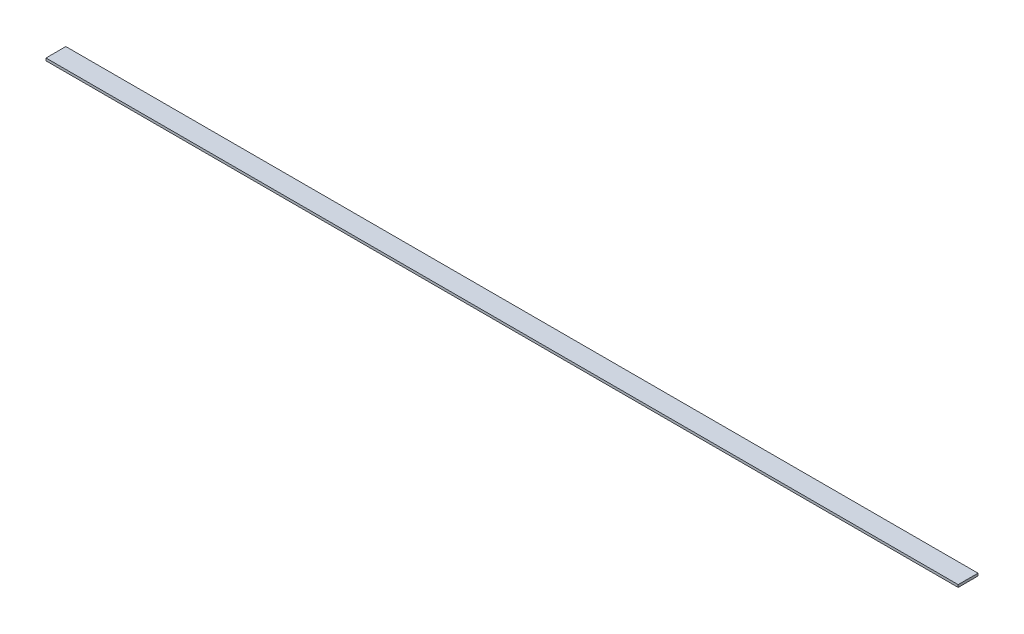
ISO-10303-21;
HEADER;
FILE_DESCRIPTION(('STEP AP214'),'2;1');
FILE_NAME('part.step','',(''),(''),'','','');
FILE_SCHEMA(('AUTOMOTIVE_DESIGN { 1 0 10303 214 1 1 1 1 }'));
ENDSEC;
DATA;
#1=APPLICATION_CONTEXT('core data for automotive mechanical design processes');
#2=APPLICATION_PROTOCOL_DEFINITION('international standard','automotive_design',2000,#1);
#3=PRODUCT_CONTEXT('',#1,'mechanical');
#4=PRODUCT('Part','Part','',(#3));
#5=PRODUCT_RELATED_PRODUCT_CATEGORY('part','',(#4));
#6=PRODUCT_DEFINITION_FORMATION('','',#4);
#7=PRODUCT_DEFINITION_CONTEXT('part definition',#1,'design');
#8=PRODUCT_DEFINITION('design','',#6,#7);
#9=PRODUCT_DEFINITION_SHAPE('','',#8);
#10=(LENGTH_UNIT() NAMED_UNIT(*) SI_UNIT(.MILLI.,.METRE.));
#11=(NAMED_UNIT(*) PLANE_ANGLE_UNIT() SI_UNIT($,.RADIAN.));
#12=(NAMED_UNIT(*) SI_UNIT($,.STERADIAN.) SOLID_ANGLE_UNIT());
#13=UNCERTAINTY_MEASURE_WITH_UNIT(LENGTH_MEASURE(1.E-05),#10,'distance_accuracy_value','');
#14=(GEOMETRIC_REPRESENTATION_CONTEXT(3) GLOBAL_UNCERTAINTY_ASSIGNED_CONTEXT((#13)) GLOBAL_UNIT_ASSIGNED_CONTEXT((#10,
#11,#12)) REPRESENTATION_CONTEXT('',''));
#15=CARTESIAN_POINT('',(0.,0.,0.));
#16=DIRECTION('',(0.,0.,1.));
#17=DIRECTION('',(1.,0.,0.));
#18=AXIS2_PLACEMENT_3D('',#15,#16,#17);
#19=CARTESIAN_POINT('',(-584.200000000001,3.175,12.7));
#20=DIRECTION('',(1.,0.,0.));
#21=DIRECTION('',(0.,0.,-1.));
#22=AXIS2_PLACEMENT_3D('',#19,#20,#21);
#23=PLANE('',#22);
#24=DIRECTION('',(0.,0.,1.));
#25=VECTOR('',#24,1.);
#26=CARTESIAN_POINT('',(-584.200000000001,0.,12.7));
#27=LINE('',#26,#25);
#28=CARTESIAN_POINT('',(-584.200000000001,0.,-12.6999999999999));
#29=VERTEX_POINT('',#28);
#30=CARTESIAN_POINT('',(-584.200000000001,0.,12.7));
#31=VERTEX_POINT('',#30);
#32=EDGE_CURVE('E107',#29,#31,#27,.T.);
#33=ORIENTED_EDGE('',*,*,#32,.T.);
#34=DIRECTION('',(0.,-1.,0.));
#35=VECTOR('',#34,1.);
#36=CARTESIAN_POINT('',(-584.200000000001,3.175,12.7));
#37=LINE('',#36,#35);
#38=CARTESIAN_POINT('',(-584.200000000001,3.175,12.7));
#39=VERTEX_POINT('',#38);
#40=EDGE_CURVE('E11',#39,#31,#37,.T.);
#41=ORIENTED_EDGE('',*,*,#40,.F.);
#42=DIRECTION('',(0.,0.,1.));
#43=VECTOR('',#42,1.);
#44=CARTESIAN_POINT('',(-584.200000000001,3.175,12.7));
#45=LINE('',#44,#43);
#46=CARTESIAN_POINT('',(-584.200000000001,3.175,-12.6999999999999));
#47=VERTEX_POINT('',#46);
#48=EDGE_CURVE('E91',#47,#39,#45,.T.);
#49=ORIENTED_EDGE('',*,*,#48,.F.);
#50=DIRECTION('',(0.,-1.,0.));
#51=VECTOR('',#50,1.);
#52=CARTESIAN_POINT('',(-584.200000000001,3.175,-12.6999999999999));
#53=LINE('',#52,#51);
#54=EDGE_CURVE('E103',#47,#29,#53,.T.);
#55=ORIENTED_EDGE('',*,*,#54,.T.);
#56=EDGE_LOOP('',(#33,#41,#49,#55));
#57=FACE_BOUND('',#56,.T.);
#58=ADVANCED_FACE('F39',(#57),#23,.F.);
#59=CARTESIAN_POINT('',(584.199999999999,3.175,12.6999999999999));
#60=DIRECTION('',(0.,0.,-1.));
#61=DIRECTION('',(-1.,0.,0.));
#62=AXIS2_PLACEMENT_3D('',#59,#60,#61);
#63=PLANE('',#62);
#64=DIRECTION('',(1.,0.,0.));
#65=VECTOR('',#64,1.);
#66=CARTESIAN_POINT('',(584.199999999999,0.,12.6999999999999));
#67=LINE('',#66,#65);
#68=CARTESIAN_POINT('',(584.199999999999,0.,12.6999999999999));
#69=VERTEX_POINT('',#68);
#70=EDGE_CURVE('E96',#31,#69,#67,.T.);
#71=ORIENTED_EDGE('',*,*,#70,.T.);
#72=DIRECTION('',(0.,-1.,0.));
#73=VECTOR('',#72,1.);
#74=CARTESIAN_POINT('',(584.199999999999,3.175,12.6999999999999));
#75=LINE('',#74,#73);
#76=CARTESIAN_POINT('',(584.199999999999,3.175,12.6999999999999));
#77=VERTEX_POINT('',#76);
#78=EDGE_CURVE('E48',#77,#69,#75,.T.);
#79=ORIENTED_EDGE('',*,*,#78,.F.);
#80=DIRECTION('',(1.,0.,0.));
#81=VECTOR('',#80,1.);
#82=CARTESIAN_POINT('',(584.199999999999,3.175,12.6999999999999));
#83=LINE('',#82,#81);
#84=EDGE_CURVE('E86',#39,#77,#83,.T.);
#85=ORIENTED_EDGE('',*,*,#84,.F.);
#86=ORIENTED_EDGE('',*,*,#40,.T.);
#87=EDGE_LOOP('',(#71,#79,#85,#86));
#88=FACE_BOUND('',#87,.T.);
#89=ADVANCED_FACE('F95',(#88),#63,.F.);
#90=CARTESIAN_POINT('',(584.199999999999,3.175,12.6999999999999));
#91=DIRECTION('',(-1.,0.,0.));
#92=DIRECTION('',(0.,0.,1.));
#93=AXIS2_PLACEMENT_3D('',#90,#91,#92);
#94=PLANE('',#93);
#95=DIRECTION('',(0.,0.,-1.));
#96=VECTOR('',#95,1.);
#97=CARTESIAN_POINT('',(584.199999999999,0.,12.6999999999999));
#98=LINE('',#97,#96);
#99=CARTESIAN_POINT('',(584.199999999998,0.,-12.7000000000001));
#100=VERTEX_POINT('',#99);
#101=EDGE_CURVE('E73',#69,#100,#98,.T.);
#102=ORIENTED_EDGE('',*,*,#101,.T.);
#103=DIRECTION('',(0.,-1.,0.));
#104=VECTOR('',#103,1.);
#105=CARTESIAN_POINT('',(584.199999999998,3.175,-12.7000000000001));
#106=LINE('',#105,#104);
#107=CARTESIAN_POINT('',(584.199999999998,3.175,-12.7000000000001));
#108=VERTEX_POINT('',#107);
#109=EDGE_CURVE('E98',#108,#100,#106,.T.);
#110=ORIENTED_EDGE('',*,*,#109,.F.);
#111=DIRECTION('',(0.,0.,-1.));
#112=VECTOR('',#111,1.);
#113=CARTESIAN_POINT('',(584.199999999999,3.175,12.6999999999999));
#114=LINE('',#113,#112);
#115=EDGE_CURVE('E89',#77,#108,#114,.T.);
#116=ORIENTED_EDGE('',*,*,#115,.F.);
#117=ORIENTED_EDGE('',*,*,#78,.T.);
#118=EDGE_LOOP('',(#102,#110,#116,#117));
#119=FACE_BOUND('',#118,.T.);
#120=ADVANCED_FACE('F99',(#119),#94,.F.);
#121=CARTESIAN_POINT('',(584.199999999998,3.175,-12.7000000000001));
#122=DIRECTION('',(0.,0.,1.));
#123=DIRECTION('',(1.,0.,0.));
#124=AXIS2_PLACEMENT_3D('',#121,#122,#123);
#125=PLANE('',#124);
#126=DIRECTION('',(-1.,0.,0.));
#127=VECTOR('',#126,1.);
#128=CARTESIAN_POINT('',(584.199999999998,0.,-12.7000000000001));
#129=LINE('',#128,#127);
#130=EDGE_CURVE('E79',#100,#29,#129,.T.);
#131=ORIENTED_EDGE('',*,*,#130,.T.);
#132=ORIENTED_EDGE('',*,*,#54,.F.);
#133=DIRECTION('',(-1.,0.,0.));
#134=VECTOR('',#133,1.);
#135=CARTESIAN_POINT('',(584.199999999998,3.175,-12.7000000000001));
#136=LINE('',#135,#134);
#137=EDGE_CURVE('E56',#108,#47,#136,.T.);
#138=ORIENTED_EDGE('',*,*,#137,.F.);
#139=ORIENTED_EDGE('',*,*,#109,.T.);
#140=EDGE_LOOP('',(#131,#132,#138,#139));
#141=FACE_BOUND('',#140,.T.);
#142=ADVANCED_FACE('F120',(#141),#125,.F.);
#143=CARTESIAN_POINT('',(0.,3.175,0.));
#144=DIRECTION('',(0.,1.,0.));
#145=DIRECTION('',(0.,0.,1.));
#146=AXIS2_PLACEMENT_3D('',#143,#144,#145);
#147=PLANE('',#146);
#148=ORIENTED_EDGE('',*,*,#48,.T.);
#149=ORIENTED_EDGE('',*,*,#84,.T.);
#150=ORIENTED_EDGE('',*,*,#115,.T.);
#151=ORIENTED_EDGE('',*,*,#137,.T.);
#152=EDGE_LOOP('',(#148,#149,#150,#151));
#153=FACE_BOUND('',#152,.T.);
#154=ADVANCED_FACE('F87',(#153),#147,.T.);
#155=CARTESIAN_POINT('',(0.,0.,0.));
#156=DIRECTION('',(0.,1.,0.));
#157=DIRECTION('',(0.,0.,1.));
#158=AXIS2_PLACEMENT_3D('',#155,#156,#157);
#159=PLANE('',#158);
#160=ORIENTED_EDGE('',*,*,#32,.F.);
#161=ORIENTED_EDGE('',*,*,#130,.F.);
#162=ORIENTED_EDGE('',*,*,#101,.F.);
#163=ORIENTED_EDGE('',*,*,#70,.F.);
#164=EDGE_LOOP('',(#160,#161,#162,#163));
#165=FACE_BOUND('',#164,.T.);
#166=ADVANCED_FACE('F123',(#165),#159,.F.);
#167=CLOSED_SHELL('',(#58,#89,#120,#142,#154,#166));
#168=MANIFOLD_SOLID_BREP('B2',#167);
#169=ADVANCED_BREP_SHAPE_REPRESENTATION('',(#18,#168),#14);
#170=SHAPE_DEFINITION_REPRESENTATION(#9,#169);
ENDSEC;
END-ISO-10303-21;
